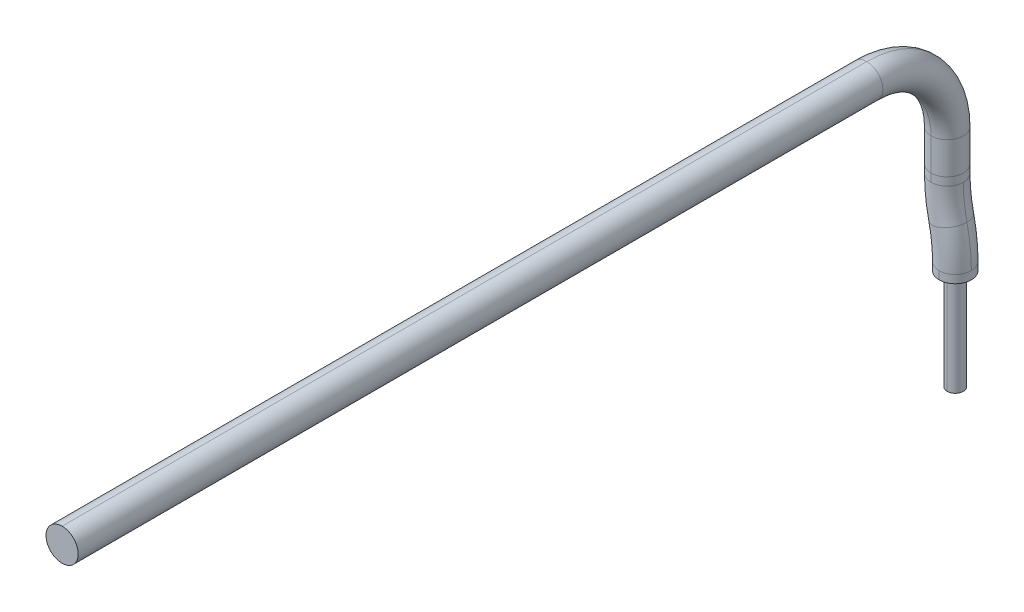
ISO-10303-21;
HEADER;
FILE_DESCRIPTION(('STEP AP214'),'2;1');
FILE_NAME('part.step','',(''),(''),'','','');
FILE_SCHEMA(('AUTOMOTIVE_DESIGN { 1 0 10303 214 1 1 1 1 }'));
ENDSEC;
DATA;
#1=APPLICATION_CONTEXT('core data for automotive mechanical design processes');
#2=APPLICATION_PROTOCOL_DEFINITION('international standard','automotive_design',2000,#1);
#3=PRODUCT_CONTEXT('',#1,'mechanical');
#4=PRODUCT('Part','Part','',(#3));
#5=PRODUCT_RELATED_PRODUCT_CATEGORY('part','',(#4));
#6=PRODUCT_DEFINITION_FORMATION('','',#4);
#7=PRODUCT_DEFINITION_CONTEXT('part definition',#1,'design');
#8=PRODUCT_DEFINITION('design','',#6,#7);
#9=PRODUCT_DEFINITION_SHAPE('','',#8);
#10=(LENGTH_UNIT() NAMED_UNIT(*) SI_UNIT(.MILLI.,.METRE.));
#11=(NAMED_UNIT(*) PLANE_ANGLE_UNIT() SI_UNIT($,.RADIAN.));
#12=(NAMED_UNIT(*) SI_UNIT($,.STERADIAN.) SOLID_ANGLE_UNIT());
#13=UNCERTAINTY_MEASURE_WITH_UNIT(LENGTH_MEASURE(1.E-05),#10,'distance_accuracy_value','');
#14=(GEOMETRIC_REPRESENTATION_CONTEXT(3) GLOBAL_UNCERTAINTY_ASSIGNED_CONTEXT((#13)) GLOBAL_UNIT_ASSIGNED_CONTEXT((#10,
#11,#12)) REPRESENTATION_CONTEXT('',''));
#15=CARTESIAN_POINT('',(0.,0.,0.));
#16=DIRECTION('',(0.,0.,1.));
#17=DIRECTION('',(1.,0.,0.));
#18=AXIS2_PLACEMENT_3D('',#15,#16,#17);
#19=CARTESIAN_POINT('',(-0.254,3.81,2.54));
#20=DIRECTION('',(1.,0.,0.));
#21=DIRECTION('',(0.,0.,-1.));
#22=AXIS2_PLACEMENT_3D('',#19,#20,#21);
#23=TOROIDAL_SURFACE('',#22,2.54,0.508);
#24=CARTESIAN_POINT('',(-0.254,3.81,0.));
#25=DIRECTION('',(0.,1.,0.));
#26=DIRECTION('',(-1.,0.,0.));
#27=AXIS2_PLACEMENT_3D('',#24,#25,#26);
#28=CIRCLE('',#27,0.508);
#29=CARTESIAN_POINT('',(-0.254,3.81,0.508));
#30=VERTEX_POINT('',#29);
#31=CARTESIAN_POINT('',(-0.254,3.81,-0.508));
#32=VERTEX_POINT('',#31);
#33=EDGE_CURVE('E11',#30,#32,#28,.T.);
#34=ORIENTED_EDGE('',*,*,#33,.T.);
#35=CARTESIAN_POINT('',(-0.254,3.81,2.54));
#36=DIRECTION('',(1.,0.,0.));
#37=DIRECTION('',(0.,0.,-1.));
#38=AXIS2_PLACEMENT_3D('',#35,#36,#37);
#39=CIRCLE('',#38,3.048);
#40=CARTESIAN_POINT('',(-0.254,6.858,2.54));
#41=VERTEX_POINT('',#40);
#42=EDGE_CURVE('E27',#32,#41,#39,.T.);
#43=ORIENTED_EDGE('',*,*,#42,.T.);
#44=CARTESIAN_POINT('',(-0.254,6.35,2.54));
#45=DIRECTION('',(0.,0.,1.));
#46=DIRECTION('',(-1.,0.,0.));
#47=AXIS2_PLACEMENT_3D('',#44,#45,#46);
#48=CIRCLE('',#47,0.508);
#49=CARTESIAN_POINT('',(-0.254,5.842,2.54));
#50=VERTEX_POINT('',#49);
#51=EDGE_CURVE('E203',#50,#41,#48,.T.);
#52=ORIENTED_EDGE('',*,*,#51,.F.);
#53=CARTESIAN_POINT('',(-0.254,3.81,2.54));
#54=DIRECTION('',(1.,0.,0.));
#55=DIRECTION('',(0.,0.,-1.));
#56=AXIS2_PLACEMENT_3D('',#53,#54,#55);
#57=CIRCLE('',#56,2.032);
#58=EDGE_CURVE('E212',#30,#50,#57,.T.);
#59=ORIENTED_EDGE('',*,*,#58,.F.);
#60=EDGE_LOOP('',(#34,#43,#52,#59));
#61=FACE_BOUND('',#60,.T.);
#62=ADVANCED_FACE('F16',(#61),#23,.T.);
#63=CARTESIAN_POINT('',(-5.207,0.254,0.));
#64=DIRECTION('',(0.,0.,1.));
#65=DIRECTION('',(1.,0.,0.));
#66=AXIS2_PLACEMENT_3D('',#63,#64,#65);
#67=TOROIDAL_SURFACE('',#66,5.207,0.508);
#68=CARTESIAN_POINT('',(0.,0.254,0.));
#69=DIRECTION('',(0.,1.,0.));
#70=DIRECTION('',(0.,0.,1.));
#71=AXIS2_PLACEMENT_3D('',#68,#69,#70);
#72=CIRCLE('',#71,0.508);
#73=CARTESIAN_POINT('',(0.,0.254,0.508));
#74=VERTEX_POINT('',#73);
#75=CARTESIAN_POINT('',(0.508,0.254,0.));
#76=VERTEX_POINT('',#75);
#77=EDGE_CURVE('E183',#74,#76,#72,.T.);
#78=ORIENTED_EDGE('',*,*,#77,.T.);
#79=CARTESIAN_POINT('',(-5.207,0.254,0.));
#80=DIRECTION('',(0.,0.,1.));
#81=DIRECTION('',(1.,0.,0.));
#82=AXIS2_PLACEMENT_3D('',#79,#80,#81);
#83=CIRCLE('',#82,5.715);
#84=CARTESIAN_POINT('',(0.36860975609756,1.50851219512195,0.));
#85=VERTEX_POINT('',#84);
#86=EDGE_CURVE('E186',#76,#85,#83,.T.);
#87=ORIENTED_EDGE('',*,*,#86,.T.);
#88=CARTESIAN_POINT('',(-0.127,1.397,0.));
#89=DIRECTION('',(-0.219512195121951,0.975609756097561,0.));
#90=DIRECTION('',(0.,0.,1.));
#91=AXIS2_PLACEMENT_3D('',#88,#89,#90);
#92=CIRCLE('',#91,0.508);
#93=CARTESIAN_POINT('',(-0.622609756097562,1.28548780487805,0.));
#94=VERTEX_POINT('',#93);
#95=EDGE_CURVE('E177',#94,#85,#92,.T.);
#96=ORIENTED_EDGE('',*,*,#95,.F.);
#97=CARTESIAN_POINT('',(-5.207,0.254,0.));
#98=DIRECTION('',(0.,0.,1.));
#99=DIRECTION('',(1.,0.,0.));
#100=AXIS2_PLACEMENT_3D('',#97,#98,#99);
#101=CIRCLE('',#100,4.699);
#102=CARTESIAN_POINT('',(-0.508,0.254,0.));
#103=VERTEX_POINT('',#102);
#104=EDGE_CURVE('E96',#103,#94,#101,.T.);
#105=ORIENTED_EDGE('',*,*,#104,.F.);
#106=CARTESIAN_POINT('',(0.,0.254,0.));
#107=DIRECTION('',(0.,1.,0.));
#108=DIRECTION('',(0.,0.,1.));
#109=AXIS2_PLACEMENT_3D('',#106,#107,#108);
#110=CIRCLE('',#109,0.508);
#111=EDGE_CURVE('E106',#103,#74,#110,.T.);
#112=ORIENTED_EDGE('',*,*,#111,.T.);
#113=EDGE_LOOP('',(#78,#87,#96,#105,#112));
#114=FACE_BOUND('',#113,.T.);
#115=ADVANCED_FACE('F306',(#114),#67,.T.);
#116=CARTESIAN_POINT('',(4.953,2.54,0.));
#117=DIRECTION('',(0.,0.,-1.));
#118=DIRECTION('',(-1.,0.,0.));
#119=AXIS2_PLACEMENT_3D('',#116,#117,#118);
#120=TOROIDAL_SURFACE('',#119,5.207,0.508);
#121=CARTESIAN_POINT('',(-0.127,1.397,0.));
#122=DIRECTION('',(-0.219512195121951,0.975609756097561,0.));
#123=DIRECTION('',(0.,0.,1.));
#124=AXIS2_PLACEMENT_3D('',#121,#122,#123);
#125=CIRCLE('',#124,0.508);
#126=EDGE_CURVE('E275',#85,#94,#125,.T.);
#127=ORIENTED_EDGE('',*,*,#126,.T.);
#128=CARTESIAN_POINT('',(4.953,2.54,0.));
#129=DIRECTION('',(0.,0.,-1.));
#130=DIRECTION('',(-1.,0.,0.));
#131=AXIS2_PLACEMENT_3D('',#128,#129,#130);
#132=CIRCLE('',#131,5.715);
#133=CARTESIAN_POINT('',(-0.762,2.54,0.));
#134=VERTEX_POINT('',#133);
#135=EDGE_CURVE('E134',#94,#134,#132,.T.);
#136=ORIENTED_EDGE('',*,*,#135,.T.);
#137=CARTESIAN_POINT('',(-0.254,2.54,0.));
#138=DIRECTION('',(0.,1.,0.));
#139=DIRECTION('',(0.,0.,1.));
#140=AXIS2_PLACEMENT_3D('',#137,#138,#139);
#141=CIRCLE('',#140,0.508);
#142=CARTESIAN_POINT('',(-0.254,2.54,-0.508));
#143=VERTEX_POINT('',#142);
#144=EDGE_CURVE('E126',#143,#134,#141,.T.);
#145=ORIENTED_EDGE('',*,*,#144,.F.);
#146=CARTESIAN_POINT('',(-0.254,2.54,0.));
#147=DIRECTION('',(0.,1.,0.));
#148=DIRECTION('',(0.,0.,1.));
#149=AXIS2_PLACEMENT_3D('',#146,#147,#148);
#150=CIRCLE('',#149,0.508);
#151=CARTESIAN_POINT('',(0.254,2.54,0.));
#152=VERTEX_POINT('',#151);
#153=EDGE_CURVE('E131',#152,#143,#150,.T.);
#154=ORIENTED_EDGE('',*,*,#153,.F.);
#155=CARTESIAN_POINT('',(4.953,2.54,0.));
#156=DIRECTION('',(0.,0.,-1.));
#157=DIRECTION('',(-1.,0.,0.));
#158=AXIS2_PLACEMENT_3D('',#155,#156,#157);
#159=CIRCLE('',#158,4.699);
#160=EDGE_CURVE('E260',#85,#152,#159,.T.);
#161=ORIENTED_EDGE('',*,*,#160,.F.);
#162=EDGE_LOOP('',(#127,#136,#145,#154,#161));
#163=FACE_BOUND('',#162,.T.);
#164=ADVANCED_FACE('F129',(#163),#120,.T.);
#165=CARTESIAN_POINT('',(-0.254,2.794,0.));
#166=DIRECTION('',(0.,-1.,0.));
#167=DIRECTION('',(0.,0.,-1.));
#168=AXIS2_PLACEMENT_3D('',#165,#166,#167);
#169=CYLINDRICAL_SURFACE('',#168,0.508);
#170=CARTESIAN_POINT('',(-0.254,2.794,0.));
#171=DIRECTION('',(0.,1.,0.));
#172=DIRECTION('',(-1.,0.,0.));
#173=AXIS2_PLACEMENT_3D('',#170,#171,#172);
#174=CIRCLE('',#173,0.508);
#175=CARTESIAN_POINT('',(-0.254,2.794,0.508));
#176=VERTEX_POINT('',#175);
#177=CARTESIAN_POINT('',(-0.254,2.794,-0.508));
#178=VERTEX_POINT('',#177);
#179=EDGE_CURVE('E150',#176,#178,#174,.T.);
#180=ORIENTED_EDGE('',*,*,#179,.F.);
#181=DIRECTION('',(0.,-1.,0.));
#182=VECTOR('',#181,1.);
#183=CARTESIAN_POINT('',(-0.254,2.794,0.508));
#184=LINE('',#183,#182);
#185=CARTESIAN_POINT('',(-0.254,2.54,0.508));
#186=VERTEX_POINT('',#185);
#187=EDGE_CURVE('E193',#176,#186,#184,.T.);
#188=ORIENTED_EDGE('',*,*,#187,.T.);
#189=CARTESIAN_POINT('',(-0.254,2.54,0.));
#190=DIRECTION('',(0.,1.,0.));
#191=DIRECTION('',(0.,0.,1.));
#192=AXIS2_PLACEMENT_3D('',#189,#190,#191);
#193=CIRCLE('',#192,0.508);
#194=EDGE_CURVE('E148',#186,#152,#193,.T.);
#195=ORIENTED_EDGE('',*,*,#194,.T.);
#196=ORIENTED_EDGE('',*,*,#153,.T.);
#197=DIRECTION('',(0.,-1.,0.));
#198=VECTOR('',#197,1.);
#199=CARTESIAN_POINT('',(-0.254,2.794,-0.508));
#200=LINE('',#199,#198);
#201=EDGE_CURVE('E140',#178,#143,#200,.T.);
#202=ORIENTED_EDGE('',*,*,#201,.F.);
#203=EDGE_LOOP('',(#180,#188,#195,#196,#202));
#204=FACE_BOUND('',#203,.T.);
#205=ADVANCED_FACE('F145',(#204),#169,.T.);
#206=CARTESIAN_POINT('',(-0.254,2.794,0.));
#207=DIRECTION('',(0.,1.,0.));
#208=DIRECTION('',(0.,0.,1.));
#209=AXIS2_PLACEMENT_3D('',#206,#207,#208);
#210=CYLINDRICAL_SURFACE('',#209,0.508);
#211=ORIENTED_EDGE('',*,*,#179,.T.);
#212=DIRECTION('',(0.,1.,0.));
#213=VECTOR('',#212,1.);
#214=CARTESIAN_POINT('',(-0.254,2.794,-0.508));
#215=LINE('',#214,#213);
#216=EDGE_CURVE('E42',#178,#32,#215,.T.);
#217=ORIENTED_EDGE('',*,*,#216,.T.);
#218=ORIENTED_EDGE('',*,*,#33,.F.);
#219=DIRECTION('',(0.,1.,0.));
#220=VECTOR('',#219,1.);
#221=CARTESIAN_POINT('',(-0.254,2.794,0.508));
#222=LINE('',#221,#220);
#223=EDGE_CURVE('E158',#176,#30,#222,.T.);
#224=ORIENTED_EDGE('',*,*,#223,.F.);
#225=EDGE_LOOP('',(#211,#217,#218,#224));
#226=FACE_BOUND('',#225,.T.);
#227=ADVANCED_FACE('F509',(#226),#210,.T.);
#228=CARTESIAN_POINT('',(-0.254,6.35,2.54));
#229=DIRECTION('',(0.,0.,1.));
#230=DIRECTION('',(0.,-1.,0.));
#231=AXIS2_PLACEMENT_3D('',#228,#229,#230);
#232=CYLINDRICAL_SURFACE('',#231,0.508);
#233=ORIENTED_EDGE('',*,*,#51,.T.);
#234=DIRECTION('',(0.,0.,1.));
#235=VECTOR('',#234,1.);
#236=CARTESIAN_POINT('',(-0.254,6.858,2.54));
#237=LINE('',#236,#235);
#238=CARTESIAN_POINT('',(-0.254,6.858,27.94));
#239=VERTEX_POINT('',#238);
#240=EDGE_CURVE('E20',#41,#239,#237,.T.);
#241=ORIENTED_EDGE('',*,*,#240,.T.);
#242=CARTESIAN_POINT('',(-0.254,6.35,27.94));
#243=DIRECTION('',(0.,0.,1.));
#244=DIRECTION('',(-1.,0.,0.));
#245=AXIS2_PLACEMENT_3D('',#242,#243,#244);
#246=CIRCLE('',#245,0.508);
#247=CARTESIAN_POINT('',(-0.254,5.842,27.94));
#248=VERTEX_POINT('',#247);
#249=EDGE_CURVE('E179',#248,#239,#246,.T.);
#250=ORIENTED_EDGE('',*,*,#249,.F.);
#251=DIRECTION('',(0.,0.,1.));
#252=VECTOR('',#251,1.);
#253=CARTESIAN_POINT('',(-0.254,5.842,2.54));
#254=LINE('',#253,#252);
#255=EDGE_CURVE('E202',#50,#248,#254,.T.);
#256=ORIENTED_EDGE('',*,*,#255,.F.);
#257=EDGE_LOOP('',(#233,#241,#250,#256));
#258=FACE_BOUND('',#257,.T.);
#259=ADVANCED_FACE('F237',(#258),#232,.T.);
#260=CARTESIAN_POINT('',(0.,-3.175,0.));
#261=DIRECTION('',(0.,1.,0.));
#262=DIRECTION('',(0.,0.,1.));
#263=AXIS2_PLACEMENT_3D('',#260,#261,#262);
#264=CYLINDRICAL_SURFACE('',#263,0.254);
#265=CARTESIAN_POINT('',(0.,-3.175,0.));
#266=DIRECTION('',(0.,-1.,0.));
#267=DIRECTION('',(0.,0.,-1.));
#268=AXIS2_PLACEMENT_3D('',#265,#266,#267);
#269=CIRCLE('',#268,0.254);
#270=CARTESIAN_POINT('',(0.,-3.175,-0.254));
#271=VERTEX_POINT('',#270);
#272=CARTESIAN_POINT('',(0.,-3.175,0.254));
#273=VERTEX_POINT('',#272);
#274=EDGE_CURVE('E192',#271,#273,#269,.T.);
#275=ORIENTED_EDGE('',*,*,#274,.F.);
#276=DIRECTION('',(0.,1.,0.));
#277=VECTOR('',#276,1.);
#278=CARTESIAN_POINT('',(0.,-3.175,-0.254));
#279=LINE('',#278,#277);
#280=CARTESIAN_POINT('',(0.,0.,-0.254));
#281=VERTEX_POINT('',#280);
#282=EDGE_CURVE('E236',#271,#281,#279,.T.);
#283=ORIENTED_EDGE('',*,*,#282,.T.);
#284=CARTESIAN_POINT('',(0.,0.,0.));
#285=DIRECTION('',(0.,-1.,0.));
#286=DIRECTION('',(0.,0.,1.));
#287=AXIS2_PLACEMENT_3D('',#284,#285,#286);
#288=CIRCLE('',#287,0.254);
#289=CARTESIAN_POINT('',(0.,0.,0.254));
#290=VERTEX_POINT('',#289);
#291=EDGE_CURVE('E250',#281,#290,#288,.T.);
#292=ORIENTED_EDGE('',*,*,#291,.T.);
#293=DIRECTION('',(0.,1.,0.));
#294=VECTOR('',#293,1.);
#295=CARTESIAN_POINT('',(0.,-3.175,0.254));
#296=LINE('',#295,#294);
#297=EDGE_CURVE('E256',#273,#290,#296,.T.);
#298=ORIENTED_EDGE('',*,*,#297,.F.);
#299=EDGE_LOOP('',(#275,#283,#292,#298));
#300=FACE_BOUND('',#299,.T.);
#301=ADVANCED_FACE('F348',(#300),#264,.T.);
#302=CARTESIAN_POINT('',(0.,0.254,0.));
#303=DIRECTION('',(0.,-1.,0.));
#304=DIRECTION('',(0.,0.,-1.));
#305=AXIS2_PLACEMENT_3D('',#302,#303,#304);
#306=CYLINDRICAL_SURFACE('',#305,0.508);
#307=ORIENTED_EDGE('',*,*,#77,.F.);
#308=DIRECTION('',(0.,-1.,0.));
#309=VECTOR('',#308,1.);
#310=CARTESIAN_POINT('',(0.,0.254,0.508));
#311=LINE('',#310,#309);
#312=CARTESIAN_POINT('',(0.,0.,0.508));
#313=VERTEX_POINT('',#312);
#314=EDGE_CURVE('E176',#74,#313,#311,.T.);
#315=ORIENTED_EDGE('',*,*,#314,.T.);
#316=CARTESIAN_POINT('',(0.,0.,0.));
#317=DIRECTION('',(0.,1.,0.));
#318=DIRECTION('',(0.,0.,1.));
#319=AXIS2_PLACEMENT_3D('',#316,#317,#318);
#320=CIRCLE('',#319,0.508);
#321=CARTESIAN_POINT('',(0.,0.,-0.508));
#322=VERTEX_POINT('',#321);
#323=EDGE_CURVE('E173',#313,#322,#320,.T.);
#324=ORIENTED_EDGE('',*,*,#323,.T.);
#325=DIRECTION('',(0.,-1.,0.));
#326=VECTOR('',#325,1.);
#327=CARTESIAN_POINT('',(0.,0.254,-0.508));
#328=LINE('',#327,#326);
#329=CARTESIAN_POINT('',(0.,0.254,-0.508));
#330=VERTEX_POINT('',#329);
#331=EDGE_CURVE('E255',#330,#322,#328,.T.);
#332=ORIENTED_EDGE('',*,*,#331,.F.);
#333=CARTESIAN_POINT('',(0.,0.254,0.));
#334=DIRECTION('',(0.,1.,0.));
#335=DIRECTION('',(0.,0.,1.));
#336=AXIS2_PLACEMENT_3D('',#333,#334,#335);
#337=CIRCLE('',#336,0.508);
#338=EDGE_CURVE('E171',#76,#330,#337,.T.);
#339=ORIENTED_EDGE('',*,*,#338,.F.);
#340=EDGE_LOOP('',(#307,#315,#324,#332,#339));
#341=FACE_BOUND('',#340,.T.);
#342=ADVANCED_FACE('F333',(#341),#306,.T.);
#343=CARTESIAN_POINT('',(4.953,2.54,0.));
#344=DIRECTION('',(0.,0.,-1.));
#345=DIRECTION('',(-1.,0.,0.));
#346=AXIS2_PLACEMENT_3D('',#343,#344,#345);
#347=TOROIDAL_SURFACE('',#346,5.207,0.508);
#348=ORIENTED_EDGE('',*,*,#135,.F.);
#349=ORIENTED_EDGE('',*,*,#95,.T.);
#350=ORIENTED_EDGE('',*,*,#160,.T.);
#351=ORIENTED_EDGE('',*,*,#194,.F.);
#352=CARTESIAN_POINT('',(-0.254,2.54,0.));
#353=DIRECTION('',(0.,1.,0.));
#354=DIRECTION('',(0.,0.,1.));
#355=AXIS2_PLACEMENT_3D('',#352,#353,#354);
#356=CIRCLE('',#355,0.508);
#357=EDGE_CURVE('E141',#134,#186,#356,.T.);
#358=ORIENTED_EDGE('',*,*,#357,.F.);
#359=EDGE_LOOP('',(#348,#349,#350,#351,#358));
#360=FACE_BOUND('',#359,.T.);
#361=ADVANCED_FACE('F308',(#360),#347,.T.);
#362=CARTESIAN_POINT('',(-5.207,0.254,0.));
#363=DIRECTION('',(0.,0.,1.));
#364=DIRECTION('',(1.,0.,0.));
#365=AXIS2_PLACEMENT_3D('',#362,#363,#364);
#366=TOROIDAL_SURFACE('',#365,5.207,0.508);
#367=ORIENTED_EDGE('',*,*,#86,.F.);
#368=ORIENTED_EDGE('',*,*,#338,.T.);
#369=CARTESIAN_POINT('',(0.,0.254,0.));
#370=DIRECTION('',(0.,1.,0.));
#371=DIRECTION('',(0.,0.,1.));
#372=AXIS2_PLACEMENT_3D('',#369,#370,#371);
#373=CIRCLE('',#372,0.508);
#374=EDGE_CURVE('E168',#330,#103,#373,.T.);
#375=ORIENTED_EDGE('',*,*,#374,.T.);
#376=ORIENTED_EDGE('',*,*,#104,.T.);
#377=ORIENTED_EDGE('',*,*,#126,.F.);
#378=EDGE_LOOP('',(#367,#368,#375,#376,#377));
#379=FACE_BOUND('',#378,.T.);
#380=ADVANCED_FACE('F304',(#379),#366,.T.);
#381=CARTESIAN_POINT('',(0.,0.254,0.));
#382=DIRECTION('',(0.,-1.,0.));
#383=DIRECTION('',(0.,0.,-1.));
#384=AXIS2_PLACEMENT_3D('',#381,#382,#383);
#385=CYLINDRICAL_SURFACE('',#384,0.508);
#386=ORIENTED_EDGE('',*,*,#314,.F.);
#387=ORIENTED_EDGE('',*,*,#111,.F.);
#388=ORIENTED_EDGE('',*,*,#374,.F.);
#389=ORIENTED_EDGE('',*,*,#331,.T.);
#390=CARTESIAN_POINT('',(0.,0.,0.));
#391=DIRECTION('',(0.,1.,0.));
#392=DIRECTION('',(0.,0.,1.));
#393=AXIS2_PLACEMENT_3D('',#390,#391,#392);
#394=CIRCLE('',#393,0.508);
#395=EDGE_CURVE('E251',#322,#313,#394,.T.);
#396=ORIENTED_EDGE('',*,*,#395,.T.);
#397=EDGE_LOOP('',(#386,#387,#388,#389,#396));
#398=FACE_BOUND('',#397,.T.);
#399=ADVANCED_FACE('F18',(#398),#385,.T.);
#400=CARTESIAN_POINT('',(0.,0.,0.));
#401=DIRECTION('',(0.,1.,0.));
#402=DIRECTION('',(1.,0.,0.));
#403=AXIS2_PLACEMENT_3D('',#400,#401,#402);
#404=PLANE('',#403);
#405=ORIENTED_EDGE('',*,*,#395,.F.);
#406=ORIENTED_EDGE('',*,*,#323,.F.);
#407=EDGE_LOOP('',(#405,#406));
#408=FACE_BOUND('',#407,.T.);
#409=CARTESIAN_POINT('',(0.,0.,0.));
#410=DIRECTION('',(0.,-1.,0.));
#411=DIRECTION('',(0.,0.,1.));
#412=AXIS2_PLACEMENT_3D('',#409,#410,#411);
#413=CIRCLE('',#412,0.254);
#414=EDGE_CURVE('E191',#290,#281,#413,.T.);
#415=ORIENTED_EDGE('',*,*,#414,.F.);
#416=ORIENTED_EDGE('',*,*,#291,.F.);
#417=EDGE_LOOP('',(#415,#416));
#418=FACE_BOUND('',#417,.T.);
#419=ADVANCED_FACE('F337',(#408,#418),#404,.F.);
#420=CARTESIAN_POINT('',(0.,-3.175,0.));
#421=DIRECTION('',(0.,1.,0.));
#422=DIRECTION('',(0.,0.,1.));
#423=AXIS2_PLACEMENT_3D('',#420,#421,#422);
#424=CYLINDRICAL_SURFACE('',#423,0.254);
#425=ORIENTED_EDGE('',*,*,#282,.F.);
#426=CARTESIAN_POINT('',(0.,-3.175,0.));
#427=DIRECTION('',(0.,-1.,0.));
#428=DIRECTION('',(0.,0.,-1.));
#429=AXIS2_PLACEMENT_3D('',#426,#427,#428);
#430=CIRCLE('',#429,0.254);
#431=EDGE_CURVE('E187',#273,#271,#430,.T.);
#432=ORIENTED_EDGE('',*,*,#431,.F.);
#433=ORIENTED_EDGE('',*,*,#297,.T.);
#434=ORIENTED_EDGE('',*,*,#414,.T.);
#435=EDGE_LOOP('',(#425,#432,#433,#434));
#436=FACE_BOUND('',#435,.T.);
#437=ADVANCED_FACE('F340',(#436),#424,.T.);
#438=CARTESIAN_POINT('',(0.,-3.175,0.));
#439=DIRECTION('',(0.,-1.,0.));
#440=DIRECTION('',(0.,0.,-1.));
#441=AXIS2_PLACEMENT_3D('',#438,#439,#440);
#442=PLANE('',#441);
#443=ORIENTED_EDGE('',*,*,#431,.T.);
#444=ORIENTED_EDGE('',*,*,#274,.T.);
#445=EDGE_LOOP('',(#443,#444));
#446=FACE_BOUND('',#445,.T.);
#447=ADVANCED_FACE('F350',(#446),#442,.T.);
#448=CARTESIAN_POINT('',(-0.254,6.35,2.54));
#449=DIRECTION('',(0.,0.,1.));
#450=DIRECTION('',(0.,-1.,0.));
#451=AXIS2_PLACEMENT_3D('',#448,#449,#450);
#452=CYLINDRICAL_SURFACE('',#451,0.508);
#453=ORIENTED_EDGE('',*,*,#240,.F.);
#454=CARTESIAN_POINT('',(-0.254,6.35,2.54));
#455=DIRECTION('',(0.,0.,1.));
#456=DIRECTION('',(-1.,0.,0.));
#457=AXIS2_PLACEMENT_3D('',#454,#455,#456);
#458=CIRCLE('',#457,0.508);
#459=EDGE_CURVE('E198',#41,#50,#458,.T.);
#460=ORIENTED_EDGE('',*,*,#459,.T.);
#461=ORIENTED_EDGE('',*,*,#255,.T.);
#462=CARTESIAN_POINT('',(-0.254,6.35,27.94));
#463=DIRECTION('',(0.,0.,1.));
#464=DIRECTION('',(-1.,0.,0.));
#465=AXIS2_PLACEMENT_3D('',#462,#463,#464);
#466=CIRCLE('',#465,0.508);
#467=EDGE_CURVE('E182',#239,#248,#466,.T.);
#468=ORIENTED_EDGE('',*,*,#467,.F.);
#469=EDGE_LOOP('',(#453,#460,#461,#468));
#470=FACE_BOUND('',#469,.T.);
#471=ADVANCED_FACE('F229',(#470),#452,.T.);
#472=CARTESIAN_POINT('',(-0.254,3.81,2.54));
#473=DIRECTION('',(1.,0.,0.));
#474=DIRECTION('',(0.,0.,-1.));
#475=AXIS2_PLACEMENT_3D('',#472,#473,#474);
#476=TOROIDAL_SURFACE('',#475,2.54,0.508);
#477=ORIENTED_EDGE('',*,*,#42,.F.);
#478=CARTESIAN_POINT('',(-0.254,3.81,0.));
#479=DIRECTION('',(0.,1.,0.));
#480=DIRECTION('',(-1.,0.,0.));
#481=AXIS2_PLACEMENT_3D('',#478,#479,#480);
#482=CIRCLE('',#481,0.508);
#483=EDGE_CURVE('E239',#32,#30,#482,.T.);
#484=ORIENTED_EDGE('',*,*,#483,.T.);
#485=ORIENTED_EDGE('',*,*,#58,.T.);
#486=ORIENTED_EDGE('',*,*,#459,.F.);
#487=EDGE_LOOP('',(#477,#484,#485,#486));
#488=FACE_BOUND('',#487,.T.);
#489=ADVANCED_FACE('F225',(#488),#476,.T.);
#490=CARTESIAN_POINT('',(-0.254,2.794,0.));
#491=DIRECTION('',(0.,1.,0.));
#492=DIRECTION('',(0.,0.,1.));
#493=AXIS2_PLACEMENT_3D('',#490,#491,#492);
#494=CYLINDRICAL_SURFACE('',#493,0.508);
#495=ORIENTED_EDGE('',*,*,#216,.F.);
#496=CARTESIAN_POINT('',(-0.254,2.794,0.));
#497=DIRECTION('',(0.,1.,0.));
#498=DIRECTION('',(-1.,0.,0.));
#499=AXIS2_PLACEMENT_3D('',#496,#497,#498);
#500=CIRCLE('',#499,0.508);
#501=EDGE_CURVE('E156',#178,#176,#500,.T.);
#502=ORIENTED_EDGE('',*,*,#501,.T.);
#503=ORIENTED_EDGE('',*,*,#223,.T.);
#504=ORIENTED_EDGE('',*,*,#483,.F.);
#505=EDGE_LOOP('',(#495,#502,#503,#504));
#506=FACE_BOUND('',#505,.T.);
#507=ADVANCED_FACE('F469',(#506),#494,.T.);
#508=CARTESIAN_POINT('',(-0.254,2.794,0.));
#509=DIRECTION('',(0.,-1.,0.));
#510=DIRECTION('',(0.,0.,-1.));
#511=AXIS2_PLACEMENT_3D('',#508,#509,#510);
#512=CYLINDRICAL_SURFACE('',#511,0.508);
#513=ORIENTED_EDGE('',*,*,#187,.F.);
#514=ORIENTED_EDGE('',*,*,#501,.F.);
#515=ORIENTED_EDGE('',*,*,#201,.T.);
#516=ORIENTED_EDGE('',*,*,#144,.T.);
#517=ORIENTED_EDGE('',*,*,#357,.T.);
#518=EDGE_LOOP('',(#513,#514,#515,#516,#517));
#519=FACE_BOUND('',#518,.T.);
#520=ADVANCED_FACE('F154',(#519),#512,.T.);
#521=CARTESIAN_POINT('',(-0.254,6.35,27.94));
#522=DIRECTION('',(0.,0.,1.));
#523=DIRECTION('',(1.,0.,0.));
#524=AXIS2_PLACEMENT_3D('',#521,#522,#523);
#525=PLANE('',#524);
#526=ORIENTED_EDGE('',*,*,#249,.T.);
#527=ORIENTED_EDGE('',*,*,#467,.T.);
#528=EDGE_LOOP('',(#526,#527));
#529=FACE_BOUND('',#528,.T.);
#530=ADVANCED_FACE('F521',(#529),#525,.T.);
#531=CLOSED_SHELL('',(#62,#115,#164,#205,#227,#259,#301,#342,#361,#380,#399,#419,#437,#447,#471,
#489,#507,#520,#530));
#532=MANIFOLD_SOLID_BREP('B1',#531);
#533=ADVANCED_BREP_SHAPE_REPRESENTATION('',(#18,#532),#14);
#534=SHAPE_DEFINITION_REPRESENTATION(#9,#533);
ENDSEC;
END-ISO-10303-21;
